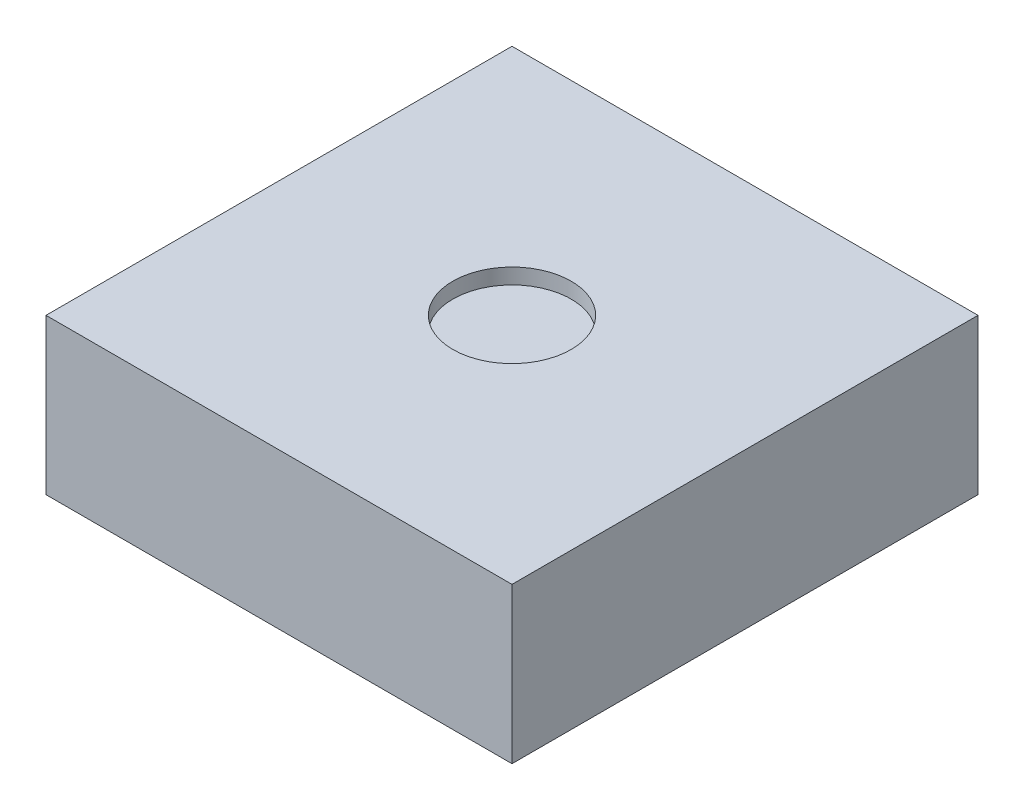
ISO-10303-21;
HEADER;
FILE_DESCRIPTION(('STEP AP214'),'2;1');
FILE_NAME('part.step','',(''),(''),'','','');
FILE_SCHEMA(('AUTOMOTIVE_DESIGN { 1 0 10303 214 1 1 1 1 }'));
ENDSEC;
DATA;
#1=APPLICATION_CONTEXT('core data for automotive mechanical design processes');
#2=APPLICATION_PROTOCOL_DEFINITION('international standard','automotive_design',2000,#1);
#3=PRODUCT_CONTEXT('',#1,'mechanical');
#4=PRODUCT('Part','Part','',(#3));
#5=PRODUCT_RELATED_PRODUCT_CATEGORY('part','',(#4));
#6=PRODUCT_DEFINITION_FORMATION('','',#4);
#7=PRODUCT_DEFINITION_CONTEXT('part definition',#1,'design');
#8=PRODUCT_DEFINITION('design','',#6,#7);
#9=PRODUCT_DEFINITION_SHAPE('','',#8);
#10=(LENGTH_UNIT() NAMED_UNIT(*) SI_UNIT(.MILLI.,.METRE.));
#11=(NAMED_UNIT(*) PLANE_ANGLE_UNIT() SI_UNIT($,.RADIAN.));
#12=(NAMED_UNIT(*) SI_UNIT($,.STERADIAN.) SOLID_ANGLE_UNIT());
#13=UNCERTAINTY_MEASURE_WITH_UNIT(LENGTH_MEASURE(1.E-05),#10,'distance_accuracy_value','');
#14=(GEOMETRIC_REPRESENTATION_CONTEXT(3) GLOBAL_UNCERTAINTY_ASSIGNED_CONTEXT((#13)) GLOBAL_UNIT_ASSIGNED_CONTEXT((#10,
#11,#12)) REPRESENTATION_CONTEXT('',''));
#15=CARTESIAN_POINT('',(0.,0.,0.));
#16=DIRECTION('',(0.,0.,1.));
#17=DIRECTION('',(1.,0.,0.));
#18=AXIS2_PLACEMENT_3D('',#15,#16,#17);
#19=CARTESIAN_POINT('',(-15.,10.,0.));
#20=DIRECTION('',(1.,0.,0.));
#21=DIRECTION('',(0.,0.,-1.));
#22=AXIS2_PLACEMENT_3D('',#19,#20,#21);
#23=PLANE('',#22);
#24=DIRECTION('',(0.,0.,1.));
#25=VECTOR('',#24,1.);
#26=CARTESIAN_POINT('',(-15.,0.,0.));
#27=LINE('',#26,#25);
#28=CARTESIAN_POINT('',(-15.,0.,-15.));
#29=VERTEX_POINT('',#28);
#30=CARTESIAN_POINT('',(-15.,0.,15.));
#31=VERTEX_POINT('',#30);
#32=EDGE_CURVE('E97',#29,#31,#27,.T.);
#33=ORIENTED_EDGE('',*,*,#32,.T.);
#34=DIRECTION('',(0.,-1.,0.));
#35=VECTOR('',#34,1.);
#36=CARTESIAN_POINT('',(-15.,10.,15.));
#37=LINE('',#36,#35);
#38=CARTESIAN_POINT('',(-15.,10.,15.));
#39=VERTEX_POINT('',#38);
#40=EDGE_CURVE('E11',#39,#31,#37,.T.);
#41=ORIENTED_EDGE('',*,*,#40,.F.);
#42=DIRECTION('',(0.,0.,1.));
#43=VECTOR('',#42,1.);
#44=CARTESIAN_POINT('',(-15.,10.,0.));
#45=LINE('',#44,#43);
#46=CARTESIAN_POINT('',(-15.,10.,-15.));
#47=VERTEX_POINT('',#46);
#48=EDGE_CURVE('E83',#47,#39,#45,.T.);
#49=ORIENTED_EDGE('',*,*,#48,.F.);
#50=DIRECTION('',(0.,-1.,0.));
#51=VECTOR('',#50,1.);
#52=CARTESIAN_POINT('',(-15.,10.,-15.));
#53=LINE('',#52,#51);
#54=EDGE_CURVE('E50',#47,#29,#53,.T.);
#55=ORIENTED_EDGE('',*,*,#54,.T.);
#56=EDGE_LOOP('',(#33,#41,#49,#55));
#57=FACE_BOUND('',#56,.T.);
#58=ADVANCED_FACE('F34',(#57),#23,.F.);
#59=CARTESIAN_POINT('',(0.,10.,15.));
#60=DIRECTION('',(0.,0.,-1.));
#61=DIRECTION('',(-1.,0.,0.));
#62=AXIS2_PLACEMENT_3D('',#59,#60,#61);
#63=PLANE('',#62);
#64=DIRECTION('',(1.,0.,0.));
#65=VECTOR('',#64,1.);
#66=CARTESIAN_POINT('',(0.,0.,15.));
#67=LINE('',#66,#65);
#68=CARTESIAN_POINT('',(15.,0.,15.));
#69=VERTEX_POINT('',#68);
#70=EDGE_CURVE('E88',#31,#69,#67,.T.);
#71=ORIENTED_EDGE('',*,*,#70,.T.);
#72=DIRECTION('',(0.,-1.,0.));
#73=VECTOR('',#72,1.);
#74=CARTESIAN_POINT('',(15.,10.,15.));
#75=LINE('',#74,#73);
#76=CARTESIAN_POINT('',(15.,10.,15.));
#77=VERTEX_POINT('',#76);
#78=EDGE_CURVE('E42',#77,#69,#75,.T.);
#79=ORIENTED_EDGE('',*,*,#78,.F.);
#80=DIRECTION('',(1.,0.,0.));
#81=VECTOR('',#80,1.);
#82=CARTESIAN_POINT('',(0.,10.,15.));
#83=LINE('',#82,#81);
#84=EDGE_CURVE('E75',#39,#77,#83,.T.);
#85=ORIENTED_EDGE('',*,*,#84,.F.);
#86=ORIENTED_EDGE('',*,*,#40,.T.);
#87=EDGE_LOOP('',(#71,#79,#85,#86));
#88=FACE_BOUND('',#87,.T.);
#89=ADVANCED_FACE('F87',(#88),#63,.F.);
#90=CARTESIAN_POINT('',(15.,10.,0.));
#91=DIRECTION('',(1.,0.,0.));
#92=DIRECTION('',(0.,0.,-1.));
#93=AXIS2_PLACEMENT_3D('',#90,#91,#92);
#94=PLANE('',#93);
#95=DIRECTION('',(0.,0.,1.));
#96=VECTOR('',#95,1.);
#97=CARTESIAN_POINT('',(15.,0.,0.));
#98=LINE('',#97,#96);
#99=CARTESIAN_POINT('',(15.,0.,-15.));
#100=VERTEX_POINT('',#99);
#101=EDGE_CURVE('E101',#100,#69,#98,.T.);
#102=ORIENTED_EDGE('',*,*,#101,.F.);
#103=DIRECTION('',(0.,-1.,0.));
#104=VECTOR('',#103,1.);
#105=CARTESIAN_POINT('',(15.,10.,-15.));
#106=LINE('',#105,#104);
#107=CARTESIAN_POINT('',(15.,10.,-15.));
#108=VERTEX_POINT('',#107);
#109=EDGE_CURVE('E64',#108,#100,#106,.T.);
#110=ORIENTED_EDGE('',*,*,#109,.F.);
#111=DIRECTION('',(0.,0.,1.));
#112=VECTOR('',#111,1.);
#113=CARTESIAN_POINT('',(15.,10.,0.));
#114=LINE('',#113,#112);
#115=EDGE_CURVE('E82',#108,#77,#114,.T.);
#116=ORIENTED_EDGE('',*,*,#115,.T.);
#117=ORIENTED_EDGE('',*,*,#78,.T.);
#118=EDGE_LOOP('',(#102,#110,#116,#117));
#119=FACE_BOUND('',#118,.T.);
#120=ADVANCED_FACE('F91',(#119),#94,.T.);
#121=CARTESIAN_POINT('',(0.,10.,-15.));
#122=DIRECTION('',(0.,0.,-1.));
#123=DIRECTION('',(-1.,0.,0.));
#124=AXIS2_PLACEMENT_3D('',#121,#122,#123);
#125=PLANE('',#124);
#126=DIRECTION('',(1.,0.,0.));
#127=VECTOR('',#126,1.);
#128=CARTESIAN_POINT('',(0.,0.,-15.));
#129=LINE('',#128,#127);
#130=EDGE_CURVE('E103',#29,#100,#129,.T.);
#131=ORIENTED_EDGE('',*,*,#130,.F.);
#132=ORIENTED_EDGE('',*,*,#54,.F.);
#133=DIRECTION('',(1.,0.,0.));
#134=VECTOR('',#133,1.);
#135=CARTESIAN_POINT('',(0.,10.,-15.));
#136=LINE('',#135,#134);
#137=EDGE_CURVE('E92',#47,#108,#136,.T.);
#138=ORIENTED_EDGE('',*,*,#137,.T.);
#139=ORIENTED_EDGE('',*,*,#109,.T.);
#140=EDGE_LOOP('',(#131,#132,#138,#139));
#141=FACE_BOUND('',#140,.T.);
#142=ADVANCED_FACE('F125',(#141),#125,.T.);
#143=CARTESIAN_POINT('',(0.,10.,0.));
#144=DIRECTION('',(0.,1.,0.));
#145=DIRECTION('',(0.,0.,1.));
#146=AXIS2_PLACEMENT_3D('',#143,#144,#145);
#147=PLANE('',#146);
#148=CARTESIAN_POINT('',(0.,10.,0.));
#149=DIRECTION('',(0.,1.,0.));
#150=DIRECTION('',(0.,0.,1.));
#151=AXIS2_PLACEMENT_3D('',#148,#149,#150);
#152=CIRCLE('',#151,3.81);
#153=CARTESIAN_POINT('',(0.,10.,3.81));
#154=VERTEX_POINT('',#153);
#155=EDGE_CURVE('E109',#154,#154,#152,.T.);
#156=ORIENTED_EDGE('',*,*,#155,.F.);
#157=EDGE_LOOP('',(#156));
#158=FACE_BOUND('',#157,.T.);
#159=ORIENTED_EDGE('',*,*,#48,.T.);
#160=ORIENTED_EDGE('',*,*,#84,.T.);
#161=ORIENTED_EDGE('',*,*,#115,.F.);
#162=ORIENTED_EDGE('',*,*,#137,.F.);
#163=EDGE_LOOP('',(#159,#160,#161,#162));
#164=FACE_BOUND('',#163,.T.);
#165=ADVANCED_FACE('F79',(#158,#164),#147,.T.);
#166=CARTESIAN_POINT('',(0.,0.,0.));
#167=DIRECTION('',(0.,1.,0.));
#168=DIRECTION('',(0.,0.,1.));
#169=AXIS2_PLACEMENT_3D('',#166,#167,#168);
#170=PLANE('',#169);
#171=ORIENTED_EDGE('',*,*,#32,.F.);
#172=ORIENTED_EDGE('',*,*,#130,.T.);
#173=ORIENTED_EDGE('',*,*,#101,.T.);
#174=ORIENTED_EDGE('',*,*,#70,.F.);
#175=EDGE_LOOP('',(#171,#172,#173,#174));
#176=FACE_BOUND('',#175,.T.);
#177=ADVANCED_FACE('F120',(#176),#170,.F.);
#178=CARTESIAN_POINT('',(0.,9.,0.));
#179=DIRECTION('',(0.,1.,0.));
#180=DIRECTION('',(0.,0.,1.));
#181=AXIS2_PLACEMENT_3D('',#178,#179,#180);
#182=CYLINDRICAL_SURFACE('',#181,3.81);
#183=CARTESIAN_POINT('',(0.,9.,0.));
#184=DIRECTION('',(0.,1.,0.));
#185=DIRECTION('',(0.,0.,1.));
#186=AXIS2_PLACEMENT_3D('',#183,#184,#185);
#187=CIRCLE('',#186,3.81);
#188=CARTESIAN_POINT('',(0.,9.,3.81));
#189=VERTEX_POINT('',#188);
#190=EDGE_CURVE('E99',#189,#189,#187,.T.);
#191=ORIENTED_EDGE('',*,*,#190,.F.);
#192=EDGE_LOOP('',(#191));
#193=FACE_BOUND('',#192,.T.);
#194=ORIENTED_EDGE('',*,*,#155,.T.);
#195=EDGE_LOOP('',(#194));
#196=FACE_BOUND('',#195,.T.);
#197=ADVANCED_FACE('F117',(#193,#196),#182,.F.);
#198=CARTESIAN_POINT('',(0.,9.,0.));
#199=DIRECTION('',(0.,1.,0.));
#200=DIRECTION('',(0.,0.,1.));
#201=AXIS2_PLACEMENT_3D('',#198,#199,#200);
#202=PLANE('',#201);
#203=ORIENTED_EDGE('',*,*,#190,.T.);
#204=EDGE_LOOP('',(#203));
#205=FACE_BOUND('',#204,.T.);
#206=ADVANCED_FACE('F115',(#205),#202,.T.);
#207=CLOSED_SHELL('',(#58,#89,#120,#142,#165,#177,#197,#206));
#208=MANIFOLD_SOLID_BREP('B2',#207);
#209=ADVANCED_BREP_SHAPE_REPRESENTATION('',(#18,#208),#14);
#210=SHAPE_DEFINITION_REPRESENTATION(#9,#209);
ENDSEC;
END-ISO-10303-21;
